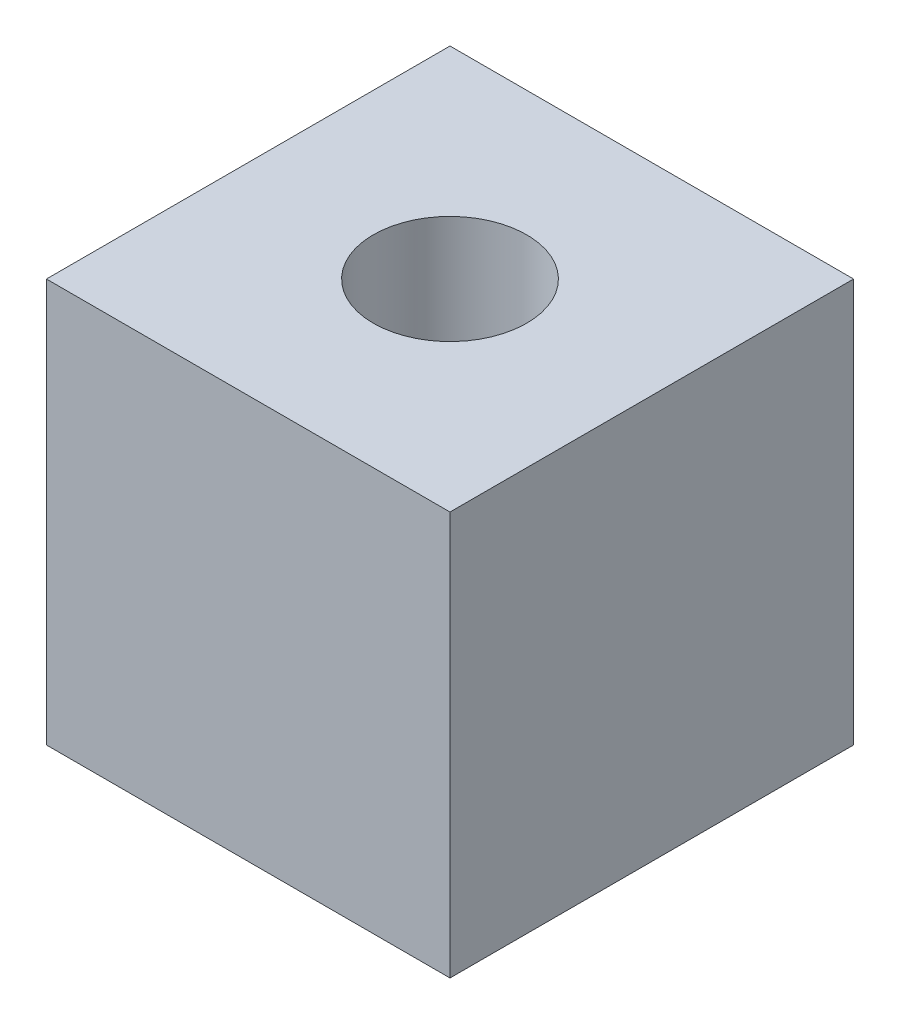
ISO-10303-21;
HEADER;
FILE_DESCRIPTION(('STEP AP214'),'2;1');
FILE_NAME('part.step','',(''),(''),'','','');
FILE_SCHEMA(('AUTOMOTIVE_DESIGN { 1 0 10303 214 1 1 1 1 }'));
ENDSEC;
DATA;
#1=APPLICATION_CONTEXT('core data for automotive mechanical design processes');
#2=APPLICATION_PROTOCOL_DEFINITION('international standard','automotive_design',2000,#1);
#3=PRODUCT_CONTEXT('',#1,'mechanical');
#4=PRODUCT('Part','Part','',(#3));
#5=PRODUCT_RELATED_PRODUCT_CATEGORY('part','',(#4));
#6=PRODUCT_DEFINITION_FORMATION('','',#4);
#7=PRODUCT_DEFINITION_CONTEXT('part definition',#1,'design');
#8=PRODUCT_DEFINITION('design','',#6,#7);
#9=PRODUCT_DEFINITION_SHAPE('','',#8);
#10=(LENGTH_UNIT() NAMED_UNIT(*) SI_UNIT(.MILLI.,.METRE.));
#11=(NAMED_UNIT(*) PLANE_ANGLE_UNIT() SI_UNIT($,.RADIAN.));
#12=(NAMED_UNIT(*) SI_UNIT($,.STERADIAN.) SOLID_ANGLE_UNIT());
#13=UNCERTAINTY_MEASURE_WITH_UNIT(LENGTH_MEASURE(1.E-05),#10,'distance_accuracy_value','');
#14=(GEOMETRIC_REPRESENTATION_CONTEXT(3) GLOBAL_UNCERTAINTY_ASSIGNED_CONTEXT((#13)) GLOBAL_UNIT_ASSIGNED_CONTEXT((#10,
#11,#12)) REPRESENTATION_CONTEXT('',''));
#15=CARTESIAN_POINT('',(0.,0.,0.));
#16=DIRECTION('',(0.,0.,1.));
#17=DIRECTION('',(1.,0.,0.));
#18=AXIS2_PLACEMENT_3D('',#15,#16,#17);
#19=CARTESIAN_POINT('',(0.,10.,0.));
#20=DIRECTION('',(1.,0.,0.));
#21=DIRECTION('',(0.,0.,-1.));
#22=AXIS2_PLACEMENT_3D('',#19,#20,#21);
#23=PLANE('',#22);
#24=DIRECTION('',(0.,0.,1.));
#25=VECTOR('',#24,1.);
#26=CARTESIAN_POINT('',(0.,0.,0.));
#27=LINE('',#26,#25);
#28=CARTESIAN_POINT('',(0.,0.,-10.));
#29=VERTEX_POINT('',#28);
#30=CARTESIAN_POINT('',(0.,0.,0.));
#31=VERTEX_POINT('',#30);
#32=EDGE_CURVE('E96',#29,#31,#27,.T.);
#33=ORIENTED_EDGE('',*,*,#32,.T.);
#34=DIRECTION('',(0.,-1.,0.));
#35=VECTOR('',#34,1.);
#36=CARTESIAN_POINT('',(0.,10.,0.));
#37=LINE('',#36,#35);
#38=CARTESIAN_POINT('',(0.,10.,0.));
#39=VERTEX_POINT('',#38);
#40=EDGE_CURVE('E11',#39,#31,#37,.T.);
#41=ORIENTED_EDGE('',*,*,#40,.F.);
#42=DIRECTION('',(0.,0.,1.));
#43=VECTOR('',#42,1.);
#44=CARTESIAN_POINT('',(0.,10.,0.));
#45=LINE('',#44,#43);
#46=CARTESIAN_POINT('',(0.,10.,-10.));
#47=VERTEX_POINT('',#46);
#48=EDGE_CURVE('E84',#47,#39,#45,.T.);
#49=ORIENTED_EDGE('',*,*,#48,.F.);
#50=DIRECTION('',(0.,-1.,0.));
#51=VECTOR('',#50,1.);
#52=CARTESIAN_POINT('',(0.,10.,-10.));
#53=LINE('',#52,#51);
#54=EDGE_CURVE('E92',#47,#29,#53,.T.);
#55=ORIENTED_EDGE('',*,*,#54,.T.);
#56=EDGE_LOOP('',(#33,#41,#49,#55));
#57=FACE_BOUND('',#56,.T.);
#58=ADVANCED_FACE('F33',(#57),#23,.F.);
#59=CARTESIAN_POINT('',(0.,10.,0.));
#60=DIRECTION('',(0.,0.,-1.));
#61=DIRECTION('',(-1.,0.,0.));
#62=AXIS2_PLACEMENT_3D('',#59,#60,#61);
#63=PLANE('',#62);
#64=DIRECTION('',(1.,0.,0.));
#65=VECTOR('',#64,1.);
#66=CARTESIAN_POINT('',(0.,0.,0.));
#67=LINE('',#66,#65);
#68=CARTESIAN_POINT('',(10.,0.,0.));
#69=VERTEX_POINT('',#68);
#70=EDGE_CURVE('E88',#31,#69,#67,.T.);
#71=ORIENTED_EDGE('',*,*,#70,.T.);
#72=DIRECTION('',(0.,-1.,0.));
#73=VECTOR('',#72,1.);
#74=CARTESIAN_POINT('',(10.,10.,0.));
#75=LINE('',#74,#73);
#76=CARTESIAN_POINT('',(10.,10.,0.));
#77=VERTEX_POINT('',#76);
#78=EDGE_CURVE('E41',#77,#69,#75,.T.);
#79=ORIENTED_EDGE('',*,*,#78,.F.);
#80=DIRECTION('',(1.,0.,0.));
#81=VECTOR('',#80,1.);
#82=CARTESIAN_POINT('',(0.,10.,0.));
#83=LINE('',#82,#81);
#84=EDGE_CURVE('E79',#39,#77,#83,.T.);
#85=ORIENTED_EDGE('',*,*,#84,.F.);
#86=ORIENTED_EDGE('',*,*,#40,.T.);
#87=EDGE_LOOP('',(#71,#79,#85,#86));
#88=FACE_BOUND('',#87,.T.);
#89=ADVANCED_FACE('F87',(#88),#63,.F.);
#90=CARTESIAN_POINT('',(10.,10.,0.));
#91=DIRECTION('',(-1.,0.,0.));
#92=DIRECTION('',(0.,0.,1.));
#93=AXIS2_PLACEMENT_3D('',#90,#91,#92);
#94=PLANE('',#93);
#95=DIRECTION('',(0.,0.,-1.));
#96=VECTOR('',#95,1.);
#97=CARTESIAN_POINT('',(10.,0.,0.));
#98=LINE('',#97,#96);
#99=CARTESIAN_POINT('',(10.,0.,-10.));
#100=VERTEX_POINT('',#99);
#101=EDGE_CURVE('E66',#69,#100,#98,.T.);
#102=ORIENTED_EDGE('',*,*,#101,.T.);
#103=DIRECTION('',(0.,-1.,0.));
#104=VECTOR('',#103,1.);
#105=CARTESIAN_POINT('',(10.,10.,-10.));
#106=LINE('',#105,#104);
#107=CARTESIAN_POINT('',(10.,10.,-10.));
#108=VERTEX_POINT('',#107);
#109=EDGE_CURVE('E89',#108,#100,#106,.T.);
#110=ORIENTED_EDGE('',*,*,#109,.F.);
#111=DIRECTION('',(0.,0.,-1.));
#112=VECTOR('',#111,1.);
#113=CARTESIAN_POINT('',(10.,10.,0.));
#114=LINE('',#113,#112);
#115=EDGE_CURVE('E82',#77,#108,#114,.T.);
#116=ORIENTED_EDGE('',*,*,#115,.F.);
#117=ORIENTED_EDGE('',*,*,#78,.T.);
#118=EDGE_LOOP('',(#102,#110,#116,#117));
#119=FACE_BOUND('',#118,.T.);
#120=ADVANCED_FACE('F90',(#119),#94,.F.);
#121=CARTESIAN_POINT('',(0.,10.,-10.));
#122=DIRECTION('',(0.,0.,1.));
#123=DIRECTION('',(1.,0.,0.));
#124=AXIS2_PLACEMENT_3D('',#121,#122,#123);
#125=PLANE('',#124);
#126=DIRECTION('',(-1.,0.,0.));
#127=VECTOR('',#126,1.);
#128=CARTESIAN_POINT('',(0.,0.,-10.));
#129=LINE('',#128,#127);
#130=EDGE_CURVE('E72',#100,#29,#129,.T.);
#131=ORIENTED_EDGE('',*,*,#130,.T.);
#132=ORIENTED_EDGE('',*,*,#54,.F.);
#133=DIRECTION('',(-1.,0.,0.));
#134=VECTOR('',#133,1.);
#135=CARTESIAN_POINT('',(0.,10.,-10.));
#136=LINE('',#135,#134);
#137=EDGE_CURVE('E49',#108,#47,#136,.T.);
#138=ORIENTED_EDGE('',*,*,#137,.F.);
#139=ORIENTED_EDGE('',*,*,#109,.T.);
#140=EDGE_LOOP('',(#131,#132,#138,#139));
#141=FACE_BOUND('',#140,.T.);
#142=ADVANCED_FACE('F104',(#141),#125,.F.);
#143=CARTESIAN_POINT('',(0.,10.,0.));
#144=DIRECTION('',(0.,-1.,0.));
#145=DIRECTION('',(0.,0.,-1.));
#146=AXIS2_PLACEMENT_3D('',#143,#144,#145);
#147=PLANE('',#146);
#148=CARTESIAN_POINT('',(5.,10.,-5.));
#149=DIRECTION('',(0.,1.,0.));
#150=DIRECTION('',(0.,0.,1.));
#151=AXIS2_PLACEMENT_3D('',#148,#149,#150);
#152=CIRCLE('',#151,1.9);
#153=CARTESIAN_POINT('',(5.,10.,-3.1));
#154=VERTEX_POINT('',#153);
#155=EDGE_CURVE('E110',#154,#154,#152,.T.);
#156=ORIENTED_EDGE('',*,*,#155,.F.);
#157=EDGE_LOOP('',(#156));
#158=FACE_BOUND('',#157,.T.);
#159=ORIENTED_EDGE('',*,*,#48,.T.);
#160=ORIENTED_EDGE('',*,*,#84,.T.);
#161=ORIENTED_EDGE('',*,*,#115,.T.);
#162=ORIENTED_EDGE('',*,*,#137,.T.);
#163=EDGE_LOOP('',(#159,#160,#161,#162));
#164=FACE_BOUND('',#163,.T.);
#165=ADVANCED_FACE('F80',(#158,#164),#147,.F.);
#166=CARTESIAN_POINT('',(0.,0.,0.));
#167=DIRECTION('',(0.,-1.,0.));
#168=DIRECTION('',(0.,0.,-1.));
#169=AXIS2_PLACEMENT_3D('',#166,#167,#168);
#170=PLANE('',#169);
#171=ORIENTED_EDGE('',*,*,#32,.F.);
#172=ORIENTED_EDGE('',*,*,#130,.F.);
#173=ORIENTED_EDGE('',*,*,#101,.F.);
#174=ORIENTED_EDGE('',*,*,#70,.F.);
#175=EDGE_LOOP('',(#171,#172,#173,#174));
#176=FACE_BOUND('',#175,.T.);
#177=ADVANCED_FACE('F107',(#176),#170,.T.);
#178=CARTESIAN_POINT('',(5.,1.5,-5.));
#179=DIRECTION('',(0.,1.,0.));
#180=DIRECTION('',(0.,0.,1.));
#181=AXIS2_PLACEMENT_3D('',#178,#179,#180);
#182=CYLINDRICAL_SURFACE('',#181,1.9);
#183=CARTESIAN_POINT('',(5.,1.5,-5.));
#184=DIRECTION('',(0.,1.,0.));
#185=DIRECTION('',(0.,0.,1.));
#186=AXIS2_PLACEMENT_3D('',#183,#184,#185);
#187=CIRCLE('',#186,1.9);
#188=CARTESIAN_POINT('',(5.,1.5,-3.1));
#189=VERTEX_POINT('',#188);
#190=EDGE_CURVE('E99',#189,#189,#187,.T.);
#191=ORIENTED_EDGE('',*,*,#190,.F.);
#192=EDGE_LOOP('',(#191));
#193=FACE_BOUND('',#192,.T.);
#194=ORIENTED_EDGE('',*,*,#155,.T.);
#195=EDGE_LOOP('',(#194));
#196=FACE_BOUND('',#195,.T.);
#197=ADVANCED_FACE('F118',(#193,#196),#182,.F.);
#198=CARTESIAN_POINT('',(5.,1.5,-5.));
#199=DIRECTION('',(0.,1.,0.));
#200=DIRECTION('',(0.,0.,1.));
#201=AXIS2_PLACEMENT_3D('',#198,#199,#200);
#202=PLANE('',#201);
#203=ORIENTED_EDGE('',*,*,#190,.T.);
#204=EDGE_LOOP('',(#203));
#205=FACE_BOUND('',#204,.T.);
#206=ADVANCED_FACE('F116',(#205),#202,.T.);
#207=CLOSED_SHELL('',(#58,#89,#120,#142,#165,#177,#197,#206));
#208=MANIFOLD_SOLID_BREP('B2',#207);
#209=ADVANCED_BREP_SHAPE_REPRESENTATION('',(#18,#208),#14);
#210=SHAPE_DEFINITION_REPRESENTATION(#9,#209);
ENDSEC;
END-ISO-10303-21;
